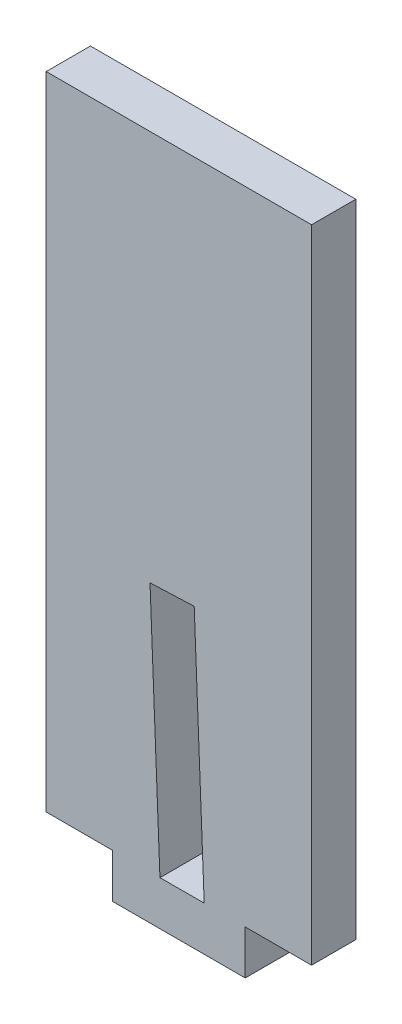
ISO-10303-21;
HEADER;
FILE_DESCRIPTION(('STEP AP214'),'2;1');
FILE_NAME('part.step','',(''),(''),'','','');
FILE_SCHEMA(('AUTOMOTIVE_DESIGN { 1 0 10303 214 1 1 1 1 }'));
ENDSEC;
DATA;
#1=APPLICATION_CONTEXT('core data for automotive mechanical design processes');
#2=APPLICATION_PROTOCOL_DEFINITION('international standard','automotive_design',2000,#1);
#3=PRODUCT_CONTEXT('',#1,'mechanical');
#4=PRODUCT('Part','Part','',(#3));
#5=PRODUCT_RELATED_PRODUCT_CATEGORY('part','',(#4));
#6=PRODUCT_DEFINITION_FORMATION('','',#4);
#7=PRODUCT_DEFINITION_CONTEXT('part definition',#1,'design');
#8=PRODUCT_DEFINITION('design','',#6,#7);
#9=PRODUCT_DEFINITION_SHAPE('','',#8);
#10=(LENGTH_UNIT() NAMED_UNIT(*) SI_UNIT(.MILLI.,.METRE.));
#11=(NAMED_UNIT(*) PLANE_ANGLE_UNIT() SI_UNIT($,.RADIAN.));
#12=(NAMED_UNIT(*) SI_UNIT($,.STERADIAN.) SOLID_ANGLE_UNIT());
#13=UNCERTAINTY_MEASURE_WITH_UNIT(LENGTH_MEASURE(1.E-05),#10,'distance_accuracy_value','');
#14=(GEOMETRIC_REPRESENTATION_CONTEXT(3) GLOBAL_UNCERTAINTY_ASSIGNED_CONTEXT((#13)) GLOBAL_UNIT_ASSIGNED_CONTEXT((#10,
#11,#12)) REPRESENTATION_CONTEXT('',''));
#15=CARTESIAN_POINT('',(0.,0.,0.));
#16=DIRECTION('',(0.,0.,1.));
#17=DIRECTION('',(1.,0.,0.));
#18=AXIS2_PLACEMENT_3D('',#15,#16,#17);
#19=CARTESIAN_POINT('',(-6.,0.,2.));
#20=DIRECTION('',(-1.,0.,0.));
#21=DIRECTION('',(0.,0.,1.));
#22=AXIS2_PLACEMENT_3D('',#19,#20,#21);
#23=PLANE('',#22);
#24=DIRECTION('',(0.,1.,0.));
#25=VECTOR('',#24,1.);
#26=CARTESIAN_POINT('',(-6.,15.,2.));
#27=LINE('',#26,#25);
#28=CARTESIAN_POINT('',(-6.,0.,2.));
#29=VERTEX_POINT('',#28);
#30=CARTESIAN_POINT('',(-6.,29.0000003609943,2.));
#31=VERTEX_POINT('',#30);
#32=EDGE_CURVE('E172',#29,#31,#27,.T.);
#33=ORIENTED_EDGE('',*,*,#32,.T.);
#34=DIRECTION('',(0.,0.,-1.));
#35=VECTOR('',#34,1.);
#36=CARTESIAN_POINT('',(-6.,29.0000003609943,2.));
#37=LINE('',#36,#35);
#38=CARTESIAN_POINT('',(-6.,29.0000003609943,0.));
#39=VERTEX_POINT('',#38);
#40=EDGE_CURVE('E168',#31,#39,#37,.T.);
#41=ORIENTED_EDGE('',*,*,#40,.T.);
#42=DIRECTION('',(0.,1.,0.));
#43=VECTOR('',#42,1.);
#44=CARTESIAN_POINT('',(-6.,0.,0.));
#45=LINE('',#44,#43);
#46=CARTESIAN_POINT('',(-6.,0.,0.));
#47=VERTEX_POINT('',#46);
#48=EDGE_CURVE('E176',#47,#39,#45,.T.);
#49=ORIENTED_EDGE('',*,*,#48,.F.);
#50=DIRECTION('',(0.,0.,-1.));
#51=VECTOR('',#50,1.);
#52=CARTESIAN_POINT('',(-6.,0.,2.));
#53=LINE('',#52,#51);
#54=EDGE_CURVE('E45',#29,#47,#53,.T.);
#55=ORIENTED_EDGE('',*,*,#54,.F.);
#56=EDGE_LOOP('',(#33,#41,#49,#55));
#57=FACE_BOUND('',#56,.T.);
#58=ADVANCED_FACE('F37',(#57),#23,.T.);
#59=CARTESIAN_POINT('',(6.,0.,2.));
#60=DIRECTION('',(-1.,0.,0.));
#61=DIRECTION('',(0.,0.,1.));
#62=AXIS2_PLACEMENT_3D('',#59,#60,#61);
#63=PLANE('',#62);
#64=DIRECTION('',(0.,0.,-1.));
#65=VECTOR('',#64,1.);
#66=CARTESIAN_POINT('',(6.,29.0000003609943,2.));
#67=LINE('',#66,#65);
#68=CARTESIAN_POINT('',(6.,29.0000003609943,2.));
#69=VERTEX_POINT('',#68);
#70=CARTESIAN_POINT('',(6.,29.0000003609943,0.));
#71=VERTEX_POINT('',#70);
#72=EDGE_CURVE('E166',#69,#71,#67,.T.);
#73=ORIENTED_EDGE('',*,*,#72,.F.);
#74=DIRECTION('',(0.,-1.,0.));
#75=VECTOR('',#74,1.);
#76=CARTESIAN_POINT('',(6.,30.0787744086171,2.));
#77=LINE('',#76,#75);
#78=CARTESIAN_POINT('',(6.,0.,2.));
#79=VERTEX_POINT('',#78);
#80=EDGE_CURVE('E175',#69,#79,#77,.T.);
#81=ORIENTED_EDGE('',*,*,#80,.T.);
#82=DIRECTION('',(0.,0.,-1.));
#83=VECTOR('',#82,1.);
#84=CARTESIAN_POINT('',(6.,0.,2.));
#85=LINE('',#84,#83);
#86=CARTESIAN_POINT('',(6.,0.,0.));
#87=VERTEX_POINT('',#86);
#88=EDGE_CURVE('E190',#79,#87,#85,.T.);
#89=ORIENTED_EDGE('',*,*,#88,.T.);
#90=DIRECTION('',(0.,1.,0.));
#91=VECTOR('',#90,1.);
#92=CARTESIAN_POINT('',(6.,0.,0.));
#93=LINE('',#92,#91);
#94=EDGE_CURVE('E171',#87,#71,#93,.T.);
#95=ORIENTED_EDGE('',*,*,#94,.T.);
#96=EDGE_LOOP('',(#73,#81,#89,#95));
#97=FACE_BOUND('',#96,.T.);
#98=ADVANCED_FACE('F39',(#97),#63,.F.);
#99=CARTESIAN_POINT('',(0.,0.,2.));
#100=DIRECTION('',(0.,0.,-1.));
#101=DIRECTION('',(-1.,0.,0.));
#102=AXIS2_PLACEMENT_3D('',#99,#100,#101);
#103=PLANE('',#102);
#104=DIRECTION('',(0.0395910990083659,-0.99921596508428,0.));
#105=VECTOR('',#104,1.);
#106=CARTESIAN_POINT('',(-0.857088089336798,0.,2.));
#107=LINE('',#106,#105);
#108=CARTESIAN_POINT('',(-1.30575418918034,11.3236141755255,2.));
#109=VERTEX_POINT('',#108);
#110=CARTESIAN_POINT('',(-0.857088089336798,0.,2.));
#111=VERTEX_POINT('',#110);
#112=EDGE_CURVE('E152',#109,#111,#107,.T.);
#113=ORIENTED_EDGE('',*,*,#112,.F.);
#114=DIRECTION('',(-0.99921596508428,-0.0395910990083688,0.));
#115=VECTOR('',#114,1.);
#116=CARTESIAN_POINT('',(0.692677740988214,11.4027963735422,2.));
#117=LINE('',#116,#115);
#118=CARTESIAN_POINT('',(0.692677740988214,11.4027963735422,2.));
#119=VERTEX_POINT('',#118);
#120=EDGE_CURVE('E52',#119,#109,#117,.T.);
#121=ORIENTED_EDGE('',*,*,#120,.F.);
#122=DIRECTION('',(-0.0395910990083687,0.99921596508428,0.));
#123=VECTOR('',#122,1.);
#124=CARTESIAN_POINT('',(1.14425173418215,0.00579162454901357,2.));
#125=LINE('',#124,#123);
#126=CARTESIAN_POINT('',(1.14425173418215,0.00579162454901357,2.));
#127=VERTEX_POINT('',#126);
#128=EDGE_CURVE('E156',#127,#119,#125,.T.);
#129=ORIENTED_EDGE('',*,*,#128,.F.);
#130=DIRECTION('',(0.999995812773993,0.00289386151721871,0.));
#131=VECTOR('',#130,1.);
#132=CARTESIAN_POINT('',(1.14425173418215,0.00579162454901357,2.));
#133=LINE('',#132,#131);
#134=EDGE_CURVE('E128',#111,#127,#133,.T.);
#135=ORIENTED_EDGE('',*,*,#134,.F.);
#136=EDGE_LOOP('',(#113,#121,#129,#135));
#137=FACE_BOUND('',#136,.T.);
#138=DIRECTION('',(-1.,0.,0.));
#139=VECTOR('',#138,1.);
#140=CARTESIAN_POINT('',(0.,29.0000003609943,2.));
#141=LINE('',#140,#139);
#142=EDGE_CURVE('E161',#69,#31,#141,.T.);
#143=ORIENTED_EDGE('',*,*,#142,.T.);
#144=ORIENTED_EDGE('',*,*,#32,.F.);
#145=DIRECTION('',(1.,0.,0.));
#146=VECTOR('',#145,1.);
#147=CARTESIAN_POINT('',(-6.,0.,2.));
#148=LINE('',#147,#146);
#149=CARTESIAN_POINT('',(-3.,0.,2.));
#150=VERTEX_POINT('',#149);
#151=EDGE_CURVE('E188',#29,#150,#148,.T.);
#152=ORIENTED_EDGE('',*,*,#151,.T.);
#153=DIRECTION('',(0.,-1.,0.));
#154=VECTOR('',#153,1.);
#155=CARTESIAN_POINT('',(-3.,0.,2.));
#156=LINE('',#155,#154);
#157=CARTESIAN_POINT('',(-3.,-2.,2.));
#158=VERTEX_POINT('',#157);
#159=EDGE_CURVE('E186',#150,#158,#156,.T.);
#160=ORIENTED_EDGE('',*,*,#159,.T.);
#161=DIRECTION('',(1.,0.,0.));
#162=VECTOR('',#161,1.);
#163=CARTESIAN_POINT('',(-3.,-2.,2.));
#164=LINE('',#163,#162);
#165=CARTESIAN_POINT('',(3.,-2.,2.));
#166=VERTEX_POINT('',#165);
#167=EDGE_CURVE('E184',#158,#166,#164,.T.);
#168=ORIENTED_EDGE('',*,*,#167,.T.);
#169=DIRECTION('',(0.,-1.,0.));
#170=VECTOR('',#169,1.);
#171=CARTESIAN_POINT('',(3.,0.,2.));
#172=LINE('',#171,#170);
#173=CARTESIAN_POINT('',(3.,0.,2.));
#174=VERTEX_POINT('',#173);
#175=EDGE_CURVE('E181',#174,#166,#172,.T.);
#176=ORIENTED_EDGE('',*,*,#175,.F.);
#177=DIRECTION('',(1.,0.,0.));
#178=VECTOR('',#177,1.);
#179=CARTESIAN_POINT('',(3.,0.,2.));
#180=LINE('',#179,#178);
#181=EDGE_CURVE('E178',#174,#79,#180,.T.);
#182=ORIENTED_EDGE('',*,*,#181,.T.);
#183=ORIENTED_EDGE('',*,*,#80,.F.);
#184=EDGE_LOOP('',(#143,#144,#152,#160,#168,#176,#182,#183));
#185=FACE_BOUND('',#184,.T.);
#186=ADVANCED_FACE('F235',(#137,#185),#103,.F.);
#187=CARTESIAN_POINT('',(0.,0.,0.));
#188=DIRECTION('',(0.,0.,-1.));
#189=DIRECTION('',(-1.,0.,0.));
#190=AXIS2_PLACEMENT_3D('',#187,#188,#189);
#191=PLANE('',#190);
#192=DIRECTION('',(-0.99921596508428,-0.0395910990083688,0.));
#193=VECTOR('',#192,1.);
#194=CARTESIAN_POINT('',(0.692677740988214,11.4027963735422,0.));
#195=LINE('',#194,#193);
#196=CARTESIAN_POINT('',(0.692677740988214,11.4027963735422,0.));
#197=VERTEX_POINT('',#196);
#198=CARTESIAN_POINT('',(-1.30575418918034,11.3236141755255,0.));
#199=VERTEX_POINT('',#198);
#200=EDGE_CURVE('E141',#197,#199,#195,.T.);
#201=ORIENTED_EDGE('',*,*,#200,.T.);
#202=DIRECTION('',(0.0395910990083658,-0.99921596508428,0.));
#203=VECTOR('',#202,1.);
#204=CARTESIAN_POINT('',(-1.29154748406176,10.9650596791543,0.));
#205=LINE('',#204,#203);
#206=CARTESIAN_POINT('',(-0.857088089336798,0.,0.));
#207=VERTEX_POINT('',#206);
#208=EDGE_CURVE('E147',#199,#207,#205,.T.);
#209=ORIENTED_EDGE('',*,*,#208,.T.);
#210=DIRECTION('',(0.999995812773993,0.00289386151721871,0.));
#211=VECTOR('',#210,1.);
#212=CARTESIAN_POINT('',(1.14425173418215,0.00579162454901357,0.));
#213=LINE('',#212,#211);
#214=CARTESIAN_POINT('',(1.14425173418215,0.00579162454901357,0.));
#215=VERTEX_POINT('',#214);
#216=EDGE_CURVE('E60',#207,#215,#213,.T.);
#217=ORIENTED_EDGE('',*,*,#216,.T.);
#218=DIRECTION('',(-0.0395910990083687,0.99921596508428,0.));
#219=VECTOR('',#218,1.);
#220=CARTESIAN_POINT('',(1.14425173418215,0.00579162454901357,0.));
#221=LINE('',#220,#219);
#222=EDGE_CURVE('E136',#215,#197,#221,.T.);
#223=ORIENTED_EDGE('',*,*,#222,.T.);
#224=EDGE_LOOP('',(#201,#209,#217,#223));
#225=FACE_BOUND('',#224,.T.);
#226=ORIENTED_EDGE('',*,*,#48,.T.);
#227=DIRECTION('',(1.,0.,0.));
#228=VECTOR('',#227,1.);
#229=CARTESIAN_POINT('',(0.,29.0000003609943,0.));
#230=LINE('',#229,#228);
#231=EDGE_CURVE('E11',#39,#71,#230,.T.);
#232=ORIENTED_EDGE('',*,*,#231,.T.);
#233=ORIENTED_EDGE('',*,*,#94,.F.);
#234=DIRECTION('',(1.,0.,0.));
#235=VECTOR('',#234,1.);
#236=CARTESIAN_POINT('',(3.,0.,0.));
#237=LINE('',#236,#235);
#238=CARTESIAN_POINT('',(3.,0.,0.));
#239=VERTEX_POINT('',#238);
#240=EDGE_CURVE('E193',#239,#87,#237,.T.);
#241=ORIENTED_EDGE('',*,*,#240,.F.);
#242=DIRECTION('',(0.,-1.,0.));
#243=VECTOR('',#242,1.);
#244=CARTESIAN_POINT('',(3.,0.,0.));
#245=LINE('',#244,#243);
#246=CARTESIAN_POINT('',(3.,-2.,0.));
#247=VERTEX_POINT('',#246);
#248=EDGE_CURVE('E195',#239,#247,#245,.T.);
#249=ORIENTED_EDGE('',*,*,#248,.T.);
#250=DIRECTION('',(1.,0.,0.));
#251=VECTOR('',#250,1.);
#252=CARTESIAN_POINT('',(-3.,-2.,0.));
#253=LINE('',#252,#251);
#254=CARTESIAN_POINT('',(-3.,-2.,0.));
#255=VERTEX_POINT('',#254);
#256=EDGE_CURVE('E198',#255,#247,#253,.T.);
#257=ORIENTED_EDGE('',*,*,#256,.F.);
#258=DIRECTION('',(0.,-1.,0.));
#259=VECTOR('',#258,1.);
#260=CARTESIAN_POINT('',(-3.,0.,0.));
#261=LINE('',#260,#259);
#262=CARTESIAN_POINT('',(-3.,0.,0.));
#263=VERTEX_POINT('',#262);
#264=EDGE_CURVE('E201',#263,#255,#261,.T.);
#265=ORIENTED_EDGE('',*,*,#264,.F.);
#266=DIRECTION('',(1.,0.,0.));
#267=VECTOR('',#266,1.);
#268=CARTESIAN_POINT('',(-6.,0.,0.));
#269=LINE('',#268,#267);
#270=EDGE_CURVE('E203',#47,#263,#269,.T.);
#271=ORIENTED_EDGE('',*,*,#270,.F.);
#272=EDGE_LOOP('',(#226,#232,#233,#241,#249,#257,#265,#271));
#273=FACE_BOUND('',#272,.T.);
#274=ADVANCED_FACE('F144',(#225,#273),#191,.T.);
#275=CARTESIAN_POINT('',(-6.,0.,2.));
#276=DIRECTION('',(0.,1.,0.));
#277=DIRECTION('',(-1.,0.,0.));
#278=AXIS2_PLACEMENT_3D('',#275,#276,#277);
#279=PLANE('',#278);
#280=ORIENTED_EDGE('',*,*,#270,.T.);
#281=DIRECTION('',(0.,0.,-1.));
#282=VECTOR('',#281,1.);
#283=CARTESIAN_POINT('',(-3.,0.,2.));
#284=LINE('',#283,#282);
#285=EDGE_CURVE('E208',#150,#263,#284,.T.);
#286=ORIENTED_EDGE('',*,*,#285,.F.);
#287=ORIENTED_EDGE('',*,*,#151,.F.);
#288=ORIENTED_EDGE('',*,*,#54,.T.);
#289=EDGE_LOOP('',(#280,#286,#287,#288));
#290=FACE_BOUND('',#289,.T.);
#291=ADVANCED_FACE('F252',(#290),#279,.F.);
#292=CARTESIAN_POINT('',(-3.,0.,2.));
#293=DIRECTION('',(1.,0.,0.));
#294=DIRECTION('',(0.,1.,0.));
#295=AXIS2_PLACEMENT_3D('',#292,#293,#294);
#296=PLANE('',#295);
#297=ORIENTED_EDGE('',*,*,#264,.T.);
#298=DIRECTION('',(0.,0.,-1.));
#299=VECTOR('',#298,1.);
#300=CARTESIAN_POINT('',(-3.,-2.,2.));
#301=LINE('',#300,#299);
#302=EDGE_CURVE('E211',#158,#255,#301,.T.);
#303=ORIENTED_EDGE('',*,*,#302,.F.);
#304=ORIENTED_EDGE('',*,*,#159,.F.);
#305=ORIENTED_EDGE('',*,*,#285,.T.);
#306=EDGE_LOOP('',(#297,#303,#304,#305));
#307=FACE_BOUND('',#306,.T.);
#308=ADVANCED_FACE('F250',(#307),#296,.F.);
#309=CARTESIAN_POINT('',(-3.,-2.,2.));
#310=DIRECTION('',(0.,1.,0.));
#311=DIRECTION('',(-1.,0.,0.));
#312=AXIS2_PLACEMENT_3D('',#309,#310,#311);
#313=PLANE('',#312);
#314=ORIENTED_EDGE('',*,*,#256,.T.);
#315=DIRECTION('',(0.,0.,-1.));
#316=VECTOR('',#315,1.);
#317=CARTESIAN_POINT('',(3.,-2.,2.));
#318=LINE('',#317,#316);
#319=EDGE_CURVE('E214',#166,#247,#318,.T.);
#320=ORIENTED_EDGE('',*,*,#319,.F.);
#321=ORIENTED_EDGE('',*,*,#167,.F.);
#322=ORIENTED_EDGE('',*,*,#302,.T.);
#323=EDGE_LOOP('',(#314,#320,#321,#322));
#324=FACE_BOUND('',#323,.T.);
#325=ADVANCED_FACE('F245',(#324),#313,.F.);
#326=CARTESIAN_POINT('',(3.,0.,2.));
#327=DIRECTION('',(1.,0.,0.));
#328=DIRECTION('',(0.,0.,-1.));
#329=AXIS2_PLACEMENT_3D('',#326,#327,#328);
#330=PLANE('',#329);
#331=ORIENTED_EDGE('',*,*,#248,.F.);
#332=DIRECTION('',(0.,0.,-1.));
#333=VECTOR('',#332,1.);
#334=CARTESIAN_POINT('',(3.,0.,2.));
#335=LINE('',#334,#333);
#336=EDGE_CURVE('E216',#174,#239,#335,.T.);
#337=ORIENTED_EDGE('',*,*,#336,.F.);
#338=ORIENTED_EDGE('',*,*,#175,.T.);
#339=ORIENTED_EDGE('',*,*,#319,.T.);
#340=EDGE_LOOP('',(#331,#337,#338,#339));
#341=FACE_BOUND('',#340,.T.);
#342=ADVANCED_FACE('F240',(#341),#330,.T.);
#343=CARTESIAN_POINT('',(3.,0.,2.));
#344=DIRECTION('',(0.,1.,0.));
#345=DIRECTION('',(-1.,0.,0.));
#346=AXIS2_PLACEMENT_3D('',#343,#344,#345);
#347=PLANE('',#346);
#348=ORIENTED_EDGE('',*,*,#240,.T.);
#349=ORIENTED_EDGE('',*,*,#88,.F.);
#350=ORIENTED_EDGE('',*,*,#181,.F.);
#351=ORIENTED_EDGE('',*,*,#336,.T.);
#352=EDGE_LOOP('',(#348,#349,#350,#351));
#353=FACE_BOUND('',#352,.T.);
#354=ADVANCED_FACE('F238',(#353),#347,.F.);
#355=CARTESIAN_POINT('',(0.,29.0000003609943,-8.));
#356=DIRECTION('',(0.,1.,0.));
#357=DIRECTION('',(-1.,0.,0.));
#358=AXIS2_PLACEMENT_3D('',#355,#356,#357);
#359=PLANE('',#358);
#360=ORIENTED_EDGE('',*,*,#142,.F.);
#361=ORIENTED_EDGE('',*,*,#72,.T.);
#362=ORIENTED_EDGE('',*,*,#231,.F.);
#363=ORIENTED_EDGE('',*,*,#40,.F.);
#364=EDGE_LOOP('',(#360,#361,#362,#363));
#365=FACE_BOUND('',#364,.T.);
#366=ADVANCED_FACE('F230',(#365),#359,.T.);
#367=CARTESIAN_POINT('',(0.692677740988214,11.4027963735422,0.));
#368=DIRECTION('',(-0.0395910990083688,0.99921596508428,0.));
#369=DIRECTION('',(-0.99921596508428,-0.0395910990083688,0.));
#370=AXIS2_PLACEMENT_3D('',#367,#368,#369);
#371=PLANE('',#370);
#372=ORIENTED_EDGE('',*,*,#120,.T.);
#373=DIRECTION('',(0.,0.,1.));
#374=VECTOR('',#373,1.);
#375=CARTESIAN_POINT('',(-1.30575418918034,11.3236141755255,0.));
#376=LINE('',#375,#374);
#377=EDGE_CURVE('E159',#199,#109,#376,.T.);
#378=ORIENTED_EDGE('',*,*,#377,.F.);
#379=ORIENTED_EDGE('',*,*,#200,.F.);
#380=DIRECTION('',(0.,0.,1.));
#381=VECTOR('',#380,1.);
#382=CARTESIAN_POINT('',(0.692677740988214,11.4027963735422,0.));
#383=LINE('',#382,#381);
#384=EDGE_CURVE('E132',#197,#119,#383,.T.);
#385=ORIENTED_EDGE('',*,*,#384,.T.);
#386=EDGE_LOOP('',(#372,#378,#379,#385));
#387=FACE_BOUND('',#386,.T.);
#388=ADVANCED_FACE('F272',(#387),#371,.F.);
#389=CARTESIAN_POINT('',(1.14425173418215,0.00579162454901357,0.));
#390=DIRECTION('',(0.99921596508428,0.0395910990083688,0.));
#391=DIRECTION('',(-0.0395910990083688,0.99921596508428,0.));
#392=AXIS2_PLACEMENT_3D('',#389,#390,#391);
#393=PLANE('',#392);
#394=ORIENTED_EDGE('',*,*,#128,.T.);
#395=ORIENTED_EDGE('',*,*,#384,.F.);
#396=ORIENTED_EDGE('',*,*,#222,.F.);
#397=DIRECTION('',(0.,0.,1.));
#398=VECTOR('',#397,1.);
#399=CARTESIAN_POINT('',(1.14425173418215,0.00579162454901357,0.));
#400=LINE('',#399,#398);
#401=EDGE_CURVE('E124',#215,#127,#400,.T.);
#402=ORIENTED_EDGE('',*,*,#401,.T.);
#403=EDGE_LOOP('',(#394,#395,#396,#402));
#404=FACE_BOUND('',#403,.T.);
#405=ADVANCED_FACE('F137',(#404),#393,.F.);
#406=CARTESIAN_POINT('',(1.14425173418215,0.00579162454901357,0.));
#407=DIRECTION('',(0.00289386151721871,-0.999995812773993,0.));
#408=DIRECTION('',(0.999995812773993,0.00289386151721871,0.));
#409=AXIS2_PLACEMENT_3D('',#406,#407,#408);
#410=PLANE('',#409);
#411=ORIENTED_EDGE('',*,*,#134,.T.);
#412=ORIENTED_EDGE('',*,*,#401,.F.);
#413=ORIENTED_EDGE('',*,*,#216,.F.);
#414=DIRECTION('',(0.,0.,1.));
#415=VECTOR('',#414,1.);
#416=CARTESIAN_POINT('',(-0.857088089336798,0.,0.));
#417=LINE('',#416,#415);
#418=EDGE_CURVE('E133',#207,#111,#417,.T.);
#419=ORIENTED_EDGE('',*,*,#418,.T.);
#420=EDGE_LOOP('',(#411,#412,#413,#419));
#421=FACE_BOUND('',#420,.T.);
#422=ADVANCED_FACE('F126',(#421),#410,.F.);
#423=CARTESIAN_POINT('',(-0.857088089336798,0.,0.));
#424=DIRECTION('',(-0.99921596508428,-0.0395910990083659,0.));
#425=DIRECTION('',(0.0395910990083659,-0.99921596508428,0.));
#426=AXIS2_PLACEMENT_3D('',#423,#424,#425);
#427=PLANE('',#426);
#428=ORIENTED_EDGE('',*,*,#112,.T.);
#429=ORIENTED_EDGE('',*,*,#418,.F.);
#430=ORIENTED_EDGE('',*,*,#208,.F.);
#431=ORIENTED_EDGE('',*,*,#377,.T.);
#432=EDGE_LOOP('',(#428,#429,#430,#431));
#433=FACE_BOUND('',#432,.T.);
#434=ADVANCED_FACE('F273',(#433),#427,.F.);
#435=CLOSED_SHELL('',(#58,#98,#186,#274,#291,#308,#325,#342,#354,#366,#388,#405,#422,#434));
#436=MANIFOLD_SOLID_BREP('B2',#435);
#437=ADVANCED_BREP_SHAPE_REPRESENTATION('',(#18,#436),#14);
#438=SHAPE_DEFINITION_REPRESENTATION(#9,#437);
ENDSEC;
END-ISO-10303-21;
